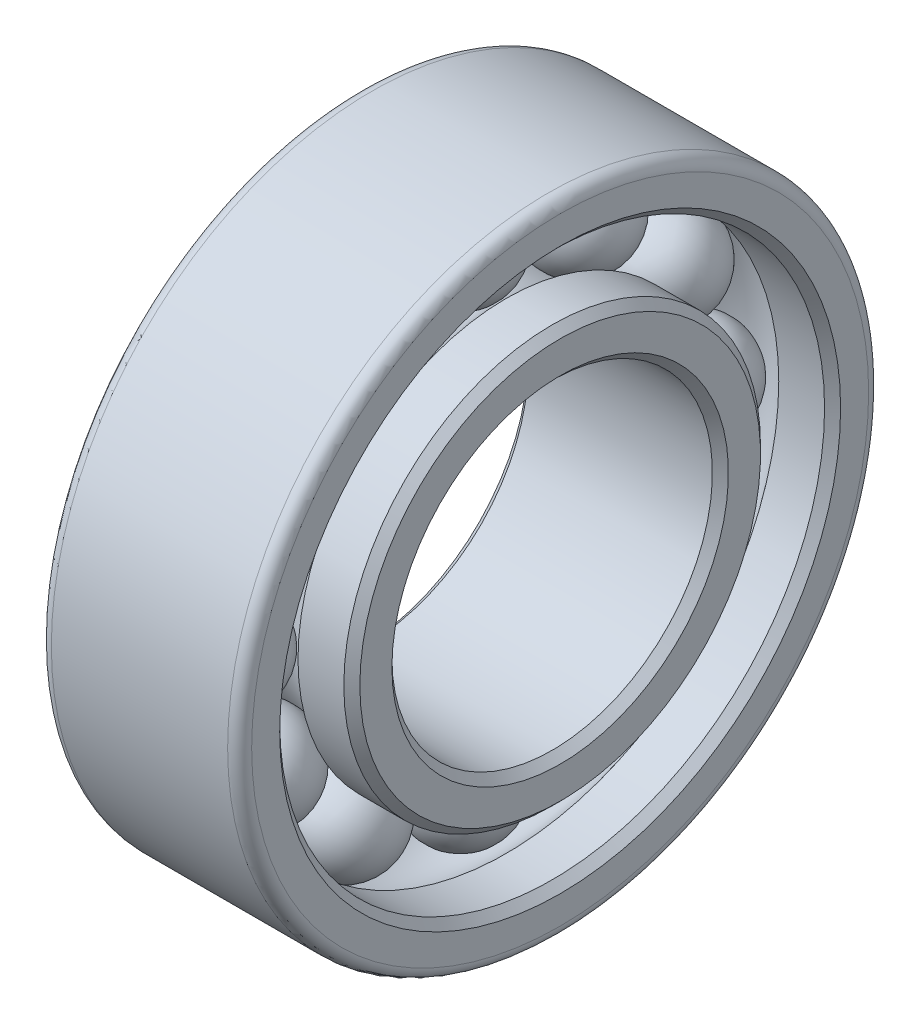
ISO-10303-21;
HEADER;
FILE_DESCRIPTION(('STEP AP214'),'2;1');
FILE_NAME('part.step','',(''),(''),'','','');
FILE_SCHEMA(('AUTOMOTIVE_DESIGN { 1 0 10303 214 1 1 1 1 }'));
ENDSEC;
DATA;
#1=APPLICATION_CONTEXT('core data for automotive mechanical design processes');
#2=APPLICATION_PROTOCOL_DEFINITION('international standard','automotive_design',2000,#1);
#3=PRODUCT_CONTEXT('',#1,'mechanical');
#4=PRODUCT('Part','Part','',(#3));
#5=PRODUCT_RELATED_PRODUCT_CATEGORY('part','',(#4));
#6=PRODUCT_DEFINITION_FORMATION('','',#4);
#7=PRODUCT_DEFINITION_CONTEXT('part definition',#1,'design');
#8=PRODUCT_DEFINITION('design','',#6,#7);
#9=PRODUCT_DEFINITION_SHAPE('','',#8);
#10=(LENGTH_UNIT() NAMED_UNIT(*) SI_UNIT(.MILLI.,.METRE.));
#11=(NAMED_UNIT(*) PLANE_ANGLE_UNIT() SI_UNIT($,.RADIAN.));
#12=(NAMED_UNIT(*) SI_UNIT($,.STERADIAN.) SOLID_ANGLE_UNIT());
#13=UNCERTAINTY_MEASURE_WITH_UNIT(LENGTH_MEASURE(1.E-05),#10,'distance_accuracy_value','');
#14=(GEOMETRIC_REPRESENTATION_CONTEXT(3) GLOBAL_UNCERTAINTY_ASSIGNED_CONTEXT((#13)) GLOBAL_UNIT_ASSIGNED_CONTEXT((#10,
#11,#12)) REPRESENTATION_CONTEXT('',''));
#15=CARTESIAN_POINT('',(0.,0.,0.));
#16=DIRECTION('',(0.,0.,1.));
#17=DIRECTION('',(1.,0.,0.));
#18=AXIS2_PLACEMENT_3D('',#15,#16,#17);
#19=CARTESIAN_POINT('',(2.51062289614978,1.06849757774923,2.9262984409004));
#20=DIRECTION('',(0.,0.866025403784445,0.499999999999989));
#21=DIRECTION('',(-1.,0.,0.));
#22=AXIS2_PLACEMENT_3D('',#19,#20,#21);
#23=SPHERICAL_SURFACE('',#22,1.25);
#24=CARTESIAN_POINT('',(2.51062289614978,2.15102933247978,3.55129844090038));
#25=VERTEX_POINT('',#24);
#26=VERTEX_LOOP('',#25);
#27=FACE_BOUND('',#26,.T.);
#28=ADVANCED_FACE('F41',(#27),#23,.T.);
#29=CLOSED_SHELL('',(#28));
#30=MANIFOLD_SOLID_BREP('B2',#29);
#31=CARTESIAN_POINT('',(2.51062289614978,-1.07370155909948,5.06849757774915));
#32=DIRECTION('',(0.,0.50000000000001,0.866025403784433));
#33=DIRECTION('',(-1.,0.,0.));
#34=AXIS2_PLACEMENT_3D('',#31,#32,#33);
#35=SPHERICAL_SURFACE('',#34,1.25);
#36=CARTESIAN_POINT('',(2.51062289614978,-0.448701559099468,6.1510293324797));
#37=VERTEX_POINT('',#36);
#38=VERTEX_LOOP('',#37);
#39=FACE_BOUND('',#38,.T.);
#40=ADVANCED_FACE('F61',(#39),#35,.T.);
#41=CLOSED_SHELL('',(#40));
#42=MANIFOLD_SOLID_BREP('B6',#41);
#43=CARTESIAN_POINT('',(2.51062289614978,-3.99999999999994,5.85259688180092));
#44=DIRECTION('',(0.,0.,1.));
#45=DIRECTION('',(-1.,0.,0.));
#46=AXIS2_PLACEMENT_3D('',#43,#44,#45);
#47=SPHERICAL_SURFACE('',#46,1.25);
#48=CARTESIAN_POINT('',(2.51062289614978,-3.99999999999993,7.10259688180092));
#49=VERTEX_POINT('',#48);
#50=VERTEX_LOOP('',#49);
#51=FACE_BOUND('',#50,.T.);
#52=ADVANCED_FACE('F81',(#51),#47,.T.);
#53=CLOSED_SHELL('',(#52));
#54=MANIFOLD_SOLID_BREP('B37',#53);
#55=CARTESIAN_POINT('',(2.51062289614978,-6.92629844090041,5.06849757774922));
#56=DIRECTION('',(0.,-0.499999999999992,0.866025403784443));
#57=DIRECTION('',(-1.,0.,0.));
#58=AXIS2_PLACEMENT_3D('',#55,#56,#57);
#59=SPHERICAL_SURFACE('',#58,1.25);
#60=CARTESIAN_POINT('',(2.51062289614978,-7.5512984409004,6.15102933247977));
#61=VERTEX_POINT('',#60);
#62=VERTEX_LOOP('',#61);
#63=FACE_BOUND('',#62,.T.);
#64=ADVANCED_FACE('F101',(#63),#59,.T.);
#65=CLOSED_SHELL('',(#64));
#66=MANIFOLD_SOLID_BREP('B57',#65);
#67=CARTESIAN_POINT('',(2.51062289614978,-9.06849757774916,2.9262984409005));
#68=DIRECTION('',(0.,-0.866025403784435,0.500000000000007));
#69=DIRECTION('',(-1.,0.,0.));
#70=AXIS2_PLACEMENT_3D('',#67,#68,#69);
#71=SPHERICAL_SURFACE('',#70,1.25);
#72=CARTESIAN_POINT('',(2.51062289614978,-10.1510293324797,3.55129844090051));
#73=VERTEX_POINT('',#72);
#74=VERTEX_LOOP('',#73);
#75=FACE_BOUND('',#74,.T.);
#76=ADVANCED_FACE('F121',(#75),#71,.T.);
#77=CLOSED_SHELL('',(#76));
#78=MANIFOLD_SOLID_BREP('B77',#77);
#79=CARTESIAN_POINT('',(2.51062289614978,-9.85259688180092,0.));
#80=DIRECTION('',(0.,-1.,0.));
#81=DIRECTION('',(-1.,0.,0.));
#82=AXIS2_PLACEMENT_3D('',#79,#80,#81);
#83=SPHERICAL_SURFACE('',#82,1.25);
#84=CARTESIAN_POINT('',(2.51062289614978,-11.1025968818009,0.));
#85=VERTEX_POINT('',#84);
#86=VERTEX_LOOP('',#85);
#87=FACE_BOUND('',#86,.T.);
#88=ADVANCED_FACE('F141',(#87),#83,.T.);
#89=CLOSED_SHELL('',(#88));
#90=MANIFOLD_SOLID_BREP('B97',#89);
#91=CARTESIAN_POINT('',(2.51062289614978,-9.06849757774921,-2.92629844090043));
#92=DIRECTION('',(0.,-0.866025403784442,-0.499999999999995));
#93=DIRECTION('',(-1.,0.,0.));
#94=AXIS2_PLACEMENT_3D('',#91,#92,#93);
#95=SPHERICAL_SURFACE('',#94,1.25);
#96=CARTESIAN_POINT('',(2.51062289614978,-10.1510293324798,-3.55129844090042));
#97=VERTEX_POINT('',#96);
#98=VERTEX_LOOP('',#97);
#99=FACE_BOUND('',#98,.T.);
#100=ADVANCED_FACE('F161',(#99),#95,.T.);
#101=CLOSED_SHELL('',(#100));
#102=MANIFOLD_SOLID_BREP('B117',#101);
#103=CARTESIAN_POINT('',(2.51062289614978,-6.92629844090048,-5.06849757774918));
#104=DIRECTION('',(0.,-0.500000000000004,-0.866025403784436));
#105=DIRECTION('',(-1.,0.,0.));
#106=AXIS2_PLACEMENT_3D('',#103,#104,#105);
#107=SPHERICAL_SURFACE('',#106,1.25);
#108=CARTESIAN_POINT('',(2.51062289614978,-7.55129844090049,-6.15102933247972));
#109=VERTEX_POINT('',#108);
#110=VERTEX_LOOP('',#109);
#111=FACE_BOUND('',#110,.T.);
#112=ADVANCED_FACE('F181',(#111),#107,.T.);
#113=CLOSED_SHELL('',(#112));
#114=MANIFOLD_SOLID_BREP('B137',#113);
#115=CARTESIAN_POINT('',(2.51062289614978,-4.00000000000002,-5.85259688180092));
#116=DIRECTION('',(0.,0.,-1.));
#117=DIRECTION('',(-1.,0.,0.));
#118=AXIS2_PLACEMENT_3D('',#115,#116,#117);
#119=SPHERICAL_SURFACE('',#118,1.25);
#120=CARTESIAN_POINT('',(2.51062289614978,-4.00000000000002,-7.10259688180092));
#121=VERTEX_POINT('',#120);
#122=VERTEX_LOOP('',#121);
#123=FACE_BOUND('',#122,.T.);
#124=ADVANCED_FACE('F201',(#123),#119,.T.);
#125=CLOSED_SHELL('',(#124));
#126=MANIFOLD_SOLID_BREP('B157',#125);
#127=CARTESIAN_POINT('',(2.51062289614978,-1.07370155909955,-5.0684975777492));
#128=DIRECTION('',(0.,0.499999999999998,-0.86602540378444));
#129=DIRECTION('',(-1.,0.,0.));
#130=AXIS2_PLACEMENT_3D('',#127,#128,#129);
#131=SPHERICAL_SURFACE('',#130,1.25);
#132=CARTESIAN_POINT('',(2.51062289614978,-0.448701559099554,-6.15102933247975));
#133=VERTEX_POINT('',#132);
#134=VERTEX_LOOP('',#133);
#135=FACE_BOUND('',#134,.T.);
#136=ADVANCED_FACE('F221',(#135),#131,.T.);
#137=CLOSED_SHELL('',(#136));
#138=MANIFOLD_SOLID_BREP('B177',#137);
#139=CARTESIAN_POINT('',(2.51062289614978,1.06849757774919,-2.92629844090047));
#140=DIRECTION('',(0.,0.866025403784438,-0.500000000000001));
#141=DIRECTION('',(-1.,0.,0.));
#142=AXIS2_PLACEMENT_3D('',#139,#140,#141);
#143=SPHERICAL_SURFACE('',#142,1.25);
#144=CARTESIAN_POINT('',(2.51062289614978,2.15102933247973,-3.55129844090047));
#145=VERTEX_POINT('',#144);
#146=VERTEX_LOOP('',#145);
#147=FACE_BOUND('',#146,.T.);
#148=ADVANCED_FACE('F241',(#147),#143,.T.);
#149=CLOSED_SHELL('',(#148));
#150=MANIFOLD_SOLID_BREP('B197',#149);
#151=CARTESIAN_POINT('',(2.51062289614978,1.85259688180092,0.));
#152=DIRECTION('',(0.,1.,0.));
#153=DIRECTION('',(-1.,0.,0.));
#154=AXIS2_PLACEMENT_3D('',#151,#152,#153);
#155=SPHERICAL_SURFACE('',#154,1.25);
#156=CARTESIAN_POINT('',(2.51062289614978,3.10259688180092,0.));
#157=VERTEX_POINT('',#156);
#158=VERTEX_LOOP('',#157);
#159=FACE_BOUND('',#158,.T.);
#160=ADVANCED_FACE('F263',(#159),#155,.T.);
#161=CLOSED_SHELL('',(#160));
#162=MANIFOLD_SOLID_BREP('B217',#161);
#163=CARTESIAN_POINT('',(0.,2.8,0.));
#164=DIRECTION('',(1.,0.,0.));
#165=DIRECTION('',(0.,0.,-1.));
#166=AXIS2_PLACEMENT_3D('',#163,#164,#165);
#167=PLANE('',#166);
#168=CARTESIAN_POINT('',(0.,-4.,0.));
#169=DIRECTION('',(1.,0.,0.));
#170=DIRECTION('',(0.,0.,-1.));
#171=AXIS2_PLACEMENT_3D('',#168,#169,#170);
#172=CIRCLE('',#171,7.);
#173=CARTESIAN_POINT('',(0.,-4.,-7.));
#174=VERTEX_POINT('',#173);
#175=EDGE_CURVE('E262',#174,#174,#172,.T.);
#176=ORIENTED_EDGE('',*,*,#175,.T.);
#177=EDGE_LOOP('',(#176));
#178=FACE_BOUND('',#177,.T.);
#179=CARTESIAN_POINT('',(0.,-4.,0.));
#180=DIRECTION('',(1.,0.,0.));
#181=DIRECTION('',(0.,0.,-1.));
#182=AXIS2_PLACEMENT_3D('',#179,#180,#181);
#183=CIRCLE('',#182,7.7);
#184=CARTESIAN_POINT('',(0.,-4.,-7.7));
#185=VERTEX_POINT('',#184);
#186=EDGE_CURVE('E302',#185,#185,#183,.F.);
#187=ORIENTED_EDGE('',*,*,#186,.T.);
#188=EDGE_LOOP('',(#187));
#189=FACE_BOUND('',#188,.T.);
#190=ADVANCED_FACE('F282',(#178,#189),#167,.F.);
#191=CARTESIAN_POINT('',(-1.0669014084507,-4.,0.));
#192=DIRECTION('',(-1.,0.,0.));
#193=DIRECTION('',(0.,0.,1.));
#194=AXIS2_PLACEMENT_3D('',#191,#192,#193);
#195=CYLINDRICAL_SURFACE('',#194,6.8);
#196=CARTESIAN_POINT('',(0.199999999999998,-4.,0.));
#197=DIRECTION('',(1.,0.,0.));
#198=DIRECTION('',(0.,0.,-1.));
#199=AXIS2_PLACEMENT_3D('',#196,#197,#198);
#200=CIRCLE('',#199,6.8);
#201=CARTESIAN_POINT('',(0.199999999999998,-4.,-6.8));
#202=VERTEX_POINT('',#201);
#203=EDGE_CURVE('E289',#202,#202,#200,.F.);
#204=ORIENTED_EDGE('',*,*,#203,.T.);
#205=EDGE_LOOP('',(#204));
#206=FACE_BOUND('',#205,.T.);
#207=CARTESIAN_POINT('',(1.36487620741247,-4.,0.));
#208=DIRECTION('',(-1.,0.,0.));
#209=DIRECTION('',(0.,0.,1.));
#210=AXIS2_PLACEMENT_3D('',#207,#208,#209);
#211=CIRCLE('',#210,6.8);
#212=CARTESIAN_POINT('',(1.36487620741247,-4.,6.8));
#213=VERTEX_POINT('',#212);
#214=EDGE_CURVE('E314',#213,#213,#211,.T.);
#215=ORIENTED_EDGE('',*,*,#214,.F.);
#216=EDGE_LOOP('',(#215));
#217=FACE_BOUND('',#216,.T.);
#218=ADVANCED_FACE('F326',(#206,#217),#195,.F.);
#219=CARTESIAN_POINT('',(2.51062289614978,-4.,0.));
#220=DIRECTION('',(-1.,0.,0.));
#221=DIRECTION('',(0.,0.,1.));
#222=AXIS2_PLACEMENT_3D('',#219,#220,#221);
#223=TOROIDAL_SURFACE('',#222,6.,1.39740311819908);
#224=CARTESIAN_POINT('',(3.65636958488709,-4.,0.));
#225=DIRECTION('',(-1.,0.,0.));
#226=DIRECTION('',(0.,0.,1.));
#227=AXIS2_PLACEMENT_3D('',#224,#225,#226);
#228=CIRCLE('',#227,6.8);
#229=CARTESIAN_POINT('',(3.65636958488709,-4.,6.8));
#230=VERTEX_POINT('',#229);
#231=EDGE_CURVE('E317',#230,#230,#228,.T.);
#232=ORIENTED_EDGE('',*,*,#231,.F.);
#233=EDGE_LOOP('',(#232));
#234=FACE_BOUND('',#233,.T.);
#235=ORIENTED_EDGE('',*,*,#214,.T.);
#236=EDGE_LOOP('',(#235));
#237=FACE_BOUND('',#236,.T.);
#238=ADVANCED_FACE('F323',(#234,#237),#223,.F.);
#239=CARTESIAN_POINT('',(-1.0669014084507,-4.,0.));
#240=DIRECTION('',(-1.,0.,0.));
#241=DIRECTION('',(0.,0.,1.));
#242=AXIS2_PLACEMENT_3D('',#239,#240,#241);
#243=CYLINDRICAL_SURFACE('',#242,6.8);
#244=CARTESIAN_POINT('',(4.8,-4.,0.));
#245=DIRECTION('',(-1.,0.,0.));
#246=DIRECTION('',(0.,0.,1.));
#247=AXIS2_PLACEMENT_3D('',#244,#245,#246);
#248=CIRCLE('',#247,6.8);
#249=CARTESIAN_POINT('',(4.8,-4.,6.8));
#250=VERTEX_POINT('',#249);
#251=EDGE_CURVE('E293',#250,#250,#248,.F.);
#252=ORIENTED_EDGE('',*,*,#251,.T.);
#253=EDGE_LOOP('',(#252));
#254=FACE_BOUND('',#253,.T.);
#255=ORIENTED_EDGE('',*,*,#231,.T.);
#256=EDGE_LOOP('',(#255));
#257=FACE_BOUND('',#256,.T.);
#258=ADVANCED_FACE('F321',(#254,#257),#243,.F.);
#259=CARTESIAN_POINT('',(5.,2.8,0.));
#260=DIRECTION('',(-1.,0.,0.));
#261=DIRECTION('',(0.,0.,1.));
#262=AXIS2_PLACEMENT_3D('',#259,#260,#261);
#263=PLANE('',#262);
#264=CARTESIAN_POINT('',(5.,-4.,0.));
#265=DIRECTION('',(-1.,0.,0.));
#266=DIRECTION('',(0.,0.,1.));
#267=AXIS2_PLACEMENT_3D('',#264,#265,#266);
#268=CIRCLE('',#267,7.);
#269=CARTESIAN_POINT('',(5.,-4.,7.));
#270=VERTEX_POINT('',#269);
#271=EDGE_CURVE('E297',#270,#270,#268,.T.);
#272=ORIENTED_EDGE('',*,*,#271,.T.);
#273=EDGE_LOOP('',(#272));
#274=FACE_BOUND('',#273,.T.);
#275=CARTESIAN_POINT('',(5.,-4.,0.));
#276=DIRECTION('',(-1.,0.,0.));
#277=DIRECTION('',(0.,0.,1.));
#278=AXIS2_PLACEMENT_3D('',#275,#276,#277);
#279=CIRCLE('',#278,7.7);
#280=CARTESIAN_POINT('',(5.,-4.,7.7));
#281=VERTEX_POINT('',#280);
#282=EDGE_CURVE('E305',#281,#281,#279,.F.);
#283=ORIENTED_EDGE('',*,*,#282,.T.);
#284=EDGE_LOOP('',(#283));
#285=FACE_BOUND('',#284,.T.);
#286=ADVANCED_FACE('F357',(#274,#285),#263,.F.);
#287=CARTESIAN_POINT('',(-1.0669014084507,-4.,0.));
#288=DIRECTION('',(-1.,0.,0.));
#289=DIRECTION('',(0.,0.,1.));
#290=AXIS2_PLACEMENT_3D('',#287,#288,#289);
#291=CYLINDRICAL_SURFACE('',#290,8.);
#292=CARTESIAN_POINT('',(4.7,-4.,0.));
#293=DIRECTION('',(-1.,0.,0.));
#294=DIRECTION('',(0.,0.,1.));
#295=AXIS2_PLACEMENT_3D('',#292,#293,#294);
#296=CIRCLE('',#295,8.);
#297=CARTESIAN_POINT('',(4.7,-4.,8.));
#298=VERTEX_POINT('',#297);
#299=EDGE_CURVE('E308',#298,#298,#296,.T.);
#300=ORIENTED_EDGE('',*,*,#299,.T.);
#301=EDGE_LOOP('',(#300));
#302=FACE_BOUND('',#301,.T.);
#303=CARTESIAN_POINT('',(0.3,-4.,0.));
#304=DIRECTION('',(1.,0.,0.));
#305=DIRECTION('',(0.,0.,-1.));
#306=AXIS2_PLACEMENT_3D('',#303,#304,#305);
#307=CIRCLE('',#306,8.);
#308=CARTESIAN_POINT('',(0.3,-4.,-8.));
#309=VERTEX_POINT('',#308);
#310=EDGE_CURVE('E311',#309,#309,#307,.T.);
#311=ORIENTED_EDGE('',*,*,#310,.T.);
#312=EDGE_LOOP('',(#311));
#313=FACE_BOUND('',#312,.T.);
#314=ADVANCED_FACE('F342',(#302,#313),#291,.T.);
#315=CARTESIAN_POINT('',(4.7,-4.,0.));
#316=DIRECTION('',(-1.,0.,0.));
#317=DIRECTION('',(0.,0.,1.));
#318=AXIS2_PLACEMENT_3D('',#315,#316,#317);
#319=TOROIDAL_SURFACE('',#318,7.7,0.3);
#320=ORIENTED_EDGE('',*,*,#282,.F.);
#321=EDGE_LOOP('',(#320));
#322=FACE_BOUND('',#321,.T.);
#323=ORIENTED_EDGE('',*,*,#299,.F.);
#324=EDGE_LOOP('',(#323));
#325=FACE_BOUND('',#324,.T.);
#326=ADVANCED_FACE('F338',(#322,#325),#319,.T.);
#327=CARTESIAN_POINT('',(0.3,-4.,0.));
#328=DIRECTION('',(1.,0.,0.));
#329=DIRECTION('',(0.,0.,-1.));
#330=AXIS2_PLACEMENT_3D('',#327,#328,#329);
#331=TOROIDAL_SURFACE('',#330,7.7,0.3);
#332=ORIENTED_EDGE('',*,*,#310,.F.);
#333=EDGE_LOOP('',(#332));
#334=FACE_BOUND('',#333,.T.);
#335=ORIENTED_EDGE('',*,*,#186,.F.);
#336=EDGE_LOOP('',(#335));
#337=FACE_BOUND('',#336,.T.);
#338=ADVANCED_FACE('F341',(#334,#337),#331,.T.);
#339=CARTESIAN_POINT('',(5.,-4.,0.));
#340=DIRECTION('',(1.,0.,0.));
#341=DIRECTION('',(0.,0.,-1.));
#342=AXIS2_PLACEMENT_3D('',#339,#340,#341);
#343=CONICAL_SURFACE('',#342,7.,0.785398163397442);
#344=ORIENTED_EDGE('',*,*,#251,.F.);
#345=EDGE_LOOP('',(#344));
#346=FACE_BOUND('',#345,.T.);
#347=ORIENTED_EDGE('',*,*,#271,.F.);
#348=EDGE_LOOP('',(#347));
#349=FACE_BOUND('',#348,.T.);
#350=ADVANCED_FACE('F345',(#346,#349),#343,.F.);
#351=CARTESIAN_POINT('',(0.199999999999998,-4.,0.));
#352=DIRECTION('',(-1.,0.,0.));
#353=DIRECTION('',(0.,0.,1.));
#354=AXIS2_PLACEMENT_3D('',#351,#352,#353);
#355=CONICAL_SURFACE('',#354,6.8,0.78539816339745);
#356=ORIENTED_EDGE('',*,*,#175,.F.);
#357=EDGE_LOOP('',(#356));
#358=FACE_BOUND('',#357,.T.);
#359=ORIENTED_EDGE('',*,*,#203,.F.);
#360=EDGE_LOOP('',(#359));
#361=FACE_BOUND('',#360,.T.);
#362=ADVANCED_FACE('F284',(#358,#361),#355,.F.);
#363=CLOSED_SHELL('',(#190,#218,#238,#258,#286,#314,#326,#338,#350,#362));
#364=MANIFOLD_SOLID_BREP('B237',#363);
#365=CARTESIAN_POINT('',(0.,0.,0.));
#366=DIRECTION('',(1.,0.,0.));
#367=DIRECTION('',(0.,0.,-1.));
#368=AXIS2_PLACEMENT_3D('',#365,#366,#367);
#369=PLANE('',#368);
#370=CARTESIAN_POINT('',(0.,-4.,0.));
#371=DIRECTION('',(1.,0.,0.));
#372=DIRECTION('',(0.,0.,-1.));
#373=AXIS2_PLACEMENT_3D('',#370,#371,#372);
#374=CIRCLE('',#373,4.2);
#375=CARTESIAN_POINT('',(0.,-4.,-4.2));
#376=VERTEX_POINT('',#375);
#377=EDGE_CURVE('E457',#376,#376,#374,.T.);
#378=ORIENTED_EDGE('',*,*,#377,.T.);
#379=EDGE_LOOP('',(#378));
#380=FACE_BOUND('',#379,.T.);
#381=CARTESIAN_POINT('',(0.,-4.,0.));
#382=DIRECTION('',(1.,0.,0.));
#383=DIRECTION('',(0.,0.,-1.));
#384=AXIS2_PLACEMENT_3D('',#381,#382,#383);
#385=CIRCLE('',#384,5.);
#386=CARTESIAN_POINT('',(0.,-4.,-5.));
#387=VERTEX_POINT('',#386);
#388=EDGE_CURVE('E460',#387,#387,#385,.F.);
#389=ORIENTED_EDGE('',*,*,#388,.T.);
#390=EDGE_LOOP('',(#389));
#391=FACE_BOUND('',#390,.T.);
#392=ADVANCED_FACE('F437',(#380,#391),#369,.F.);
#393=CARTESIAN_POINT('',(-1.0669014084507,-4.,0.));
#394=DIRECTION('',(-1.,0.,0.));
#395=DIRECTION('',(0.,0.,1.));
#396=AXIS2_PLACEMENT_3D('',#393,#394,#395);
#397=CYLINDRICAL_SURFACE('',#396,4.);
#398=CARTESIAN_POINT('',(0.200000000000001,-4.,0.));
#399=DIRECTION('',(1.,0.,0.));
#400=DIRECTION('',(0.,0.,-1.));
#401=AXIS2_PLACEMENT_3D('',#398,#399,#400);
#402=CIRCLE('',#401,4.);
#403=CARTESIAN_POINT('',(0.200000000000001,-4.,-4.));
#404=VERTEX_POINT('',#403);
#405=EDGE_CURVE('E463',#404,#404,#402,.F.);
#406=ORIENTED_EDGE('',*,*,#405,.T.);
#407=EDGE_LOOP('',(#406));
#408=FACE_BOUND('',#407,.T.);
#409=CARTESIAN_POINT('',(4.8,-4.,0.));
#410=DIRECTION('',(-1.,0.,0.));
#411=DIRECTION('',(0.,0.,1.));
#412=AXIS2_PLACEMENT_3D('',#409,#410,#411);
#413=CIRCLE('',#412,4.);
#414=CARTESIAN_POINT('',(4.8,-4.,4.));
#415=VERTEX_POINT('',#414);
#416=EDGE_CURVE('E466',#415,#415,#413,.F.);
#417=ORIENTED_EDGE('',*,*,#416,.T.);
#418=EDGE_LOOP('',(#417));
#419=FACE_BOUND('',#418,.T.);
#420=ADVANCED_FACE('F491',(#408,#419),#397,.F.);
#421=CARTESIAN_POINT('',(5.,0.,0.));
#422=DIRECTION('',(-1.,0.,0.));
#423=DIRECTION('',(0.,0.,1.));
#424=AXIS2_PLACEMENT_3D('',#421,#422,#423);
#425=PLANE('',#424);
#426=CARTESIAN_POINT('',(5.,-4.,0.));
#427=DIRECTION('',(-1.,0.,0.));
#428=DIRECTION('',(0.,0.,1.));
#429=AXIS2_PLACEMENT_3D('',#426,#427,#428);
#430=CIRCLE('',#429,4.2);
#431=CARTESIAN_POINT('',(5.,-4.,4.2));
#432=VERTEX_POINT('',#431);
#433=EDGE_CURVE('E448',#432,#432,#430,.T.);
#434=ORIENTED_EDGE('',*,*,#433,.T.);
#435=EDGE_LOOP('',(#434));
#436=FACE_BOUND('',#435,.T.);
#437=CARTESIAN_POINT('',(5.,-4.,0.));
#438=DIRECTION('',(-1.,0.,0.));
#439=DIRECTION('',(0.,0.,1.));
#440=AXIS2_PLACEMENT_3D('',#437,#438,#439);
#441=CIRCLE('',#440,5.);
#442=CARTESIAN_POINT('',(5.,-4.,5.));
#443=VERTEX_POINT('',#442);
#444=EDGE_CURVE('E452',#443,#443,#441,.F.);
#445=ORIENTED_EDGE('',*,*,#444,.T.);
#446=EDGE_LOOP('',(#445));
#447=FACE_BOUND('',#446,.T.);
#448=ADVANCED_FACE('F486',(#436,#447),#425,.F.);
#449=CARTESIAN_POINT('',(-1.0669014084507,-4.,0.));
#450=DIRECTION('',(-1.,0.,0.));
#451=DIRECTION('',(0.,0.,1.));
#452=AXIS2_PLACEMENT_3D('',#449,#450,#451);
#453=CYLINDRICAL_SURFACE('',#452,5.2);
#454=CARTESIAN_POINT('',(4.8,-4.,0.));
#455=DIRECTION('',(-1.,0.,0.));
#456=DIRECTION('',(0.,0.,1.));
#457=AXIS2_PLACEMENT_3D('',#454,#455,#456);
#458=CIRCLE('',#457,5.2);
#459=CARTESIAN_POINT('',(4.8,-4.,5.2));
#460=VERTEX_POINT('',#459);
#461=EDGE_CURVE('E444',#460,#460,#458,.T.);
#462=ORIENTED_EDGE('',*,*,#461,.T.);
#463=EDGE_LOOP('',(#462));
#464=FACE_BOUND('',#463,.T.);
#465=CARTESIAN_POINT('',(3.65636958488709,-4.,0.));
#466=DIRECTION('',(-1.,0.,0.));
#467=DIRECTION('',(0.,0.,1.));
#468=AXIS2_PLACEMENT_3D('',#465,#466,#467);
#469=CIRCLE('',#468,5.2);
#470=CARTESIAN_POINT('',(3.65636958488709,-4.,5.2));
#471=VERTEX_POINT('',#470);
#472=EDGE_CURVE('E469',#471,#471,#469,.T.);
#473=ORIENTED_EDGE('',*,*,#472,.F.);
#474=EDGE_LOOP('',(#473));
#475=FACE_BOUND('',#474,.T.);
#476=ADVANCED_FACE('F481',(#464,#475),#453,.T.);
#477=CARTESIAN_POINT('',(2.51062289614978,-4.,0.));
#478=DIRECTION('',(-1.,0.,0.));
#479=DIRECTION('',(0.,0.,1.));
#480=AXIS2_PLACEMENT_3D('',#477,#478,#479);
#481=TOROIDAL_SURFACE('',#480,6.,1.39740311819908);
#482=CARTESIAN_POINT('',(1.36487620741247,-4.,0.));
#483=DIRECTION('',(-1.,0.,0.));
#484=DIRECTION('',(0.,0.,1.));
#485=AXIS2_PLACEMENT_3D('',#482,#483,#484);
#486=CIRCLE('',#485,5.2);
#487=CARTESIAN_POINT('',(1.36487620741247,-4.,5.2));
#488=VERTEX_POINT('',#487);
#489=EDGE_CURVE('E472',#488,#488,#486,.T.);
#490=ORIENTED_EDGE('',*,*,#489,.F.);
#491=EDGE_LOOP('',(#490));
#492=FACE_BOUND('',#491,.T.);
#493=ORIENTED_EDGE('',*,*,#472,.T.);
#494=EDGE_LOOP('',(#493));
#495=FACE_BOUND('',#494,.T.);
#496=ADVANCED_FACE('F478',(#492,#495),#481,.F.);
#497=CARTESIAN_POINT('',(-1.0669014084507,-4.,0.));
#498=DIRECTION('',(-1.,0.,0.));
#499=DIRECTION('',(0.,0.,1.));
#500=AXIS2_PLACEMENT_3D('',#497,#498,#499);
#501=CYLINDRICAL_SURFACE('',#500,5.2);
#502=CARTESIAN_POINT('',(0.200000000000006,-4.,0.));
#503=DIRECTION('',(1.,0.,0.));
#504=DIRECTION('',(0.,0.,-1.));
#505=AXIS2_PLACEMENT_3D('',#502,#503,#504);
#506=CIRCLE('',#505,5.2);
#507=CARTESIAN_POINT('',(0.200000000000006,-4.,-5.2));
#508=VERTEX_POINT('',#507);
#509=EDGE_CURVE('E281',#508,#508,#506,.T.);
#510=ORIENTED_EDGE('',*,*,#509,.T.);
#511=EDGE_LOOP('',(#510));
#512=FACE_BOUND('',#511,.T.);
#513=ORIENTED_EDGE('',*,*,#489,.T.);
#514=EDGE_LOOP('',(#513));
#515=FACE_BOUND('',#514,.T.);
#516=ADVANCED_FACE('F476',(#512,#515),#501,.T.);
#517=CARTESIAN_POINT('',(0.200000000000001,-4.,0.));
#518=DIRECTION('',(-1.,0.,0.));
#519=DIRECTION('',(0.,0.,1.));
#520=AXIS2_PLACEMENT_3D('',#517,#518,#519);
#521=CONICAL_SURFACE('',#520,4.,0.785398163397448);
#522=ORIENTED_EDGE('',*,*,#377,.F.);
#523=EDGE_LOOP('',(#522));
#524=FACE_BOUND('',#523,.T.);
#525=ORIENTED_EDGE('',*,*,#405,.F.);
#526=EDGE_LOOP('',(#525));
#527=FACE_BOUND('',#526,.T.);
#528=ADVANCED_FACE('F504',(#524,#527),#521,.F.);
#529=CARTESIAN_POINT('',(5.,-4.,0.));
#530=DIRECTION('',(1.,0.,0.));
#531=DIRECTION('',(0.,0.,-1.));
#532=AXIS2_PLACEMENT_3D('',#529,#530,#531);
#533=CONICAL_SURFACE('',#532,4.2,0.785398163397442);
#534=ORIENTED_EDGE('',*,*,#416,.F.);
#535=EDGE_LOOP('',(#534));
#536=FACE_BOUND('',#535,.T.);
#537=ORIENTED_EDGE('',*,*,#433,.F.);
#538=EDGE_LOOP('',(#537));
#539=FACE_BOUND('',#538,.T.);
#540=ADVANCED_FACE('F507',(#536,#539),#533,.F.);
#541=CARTESIAN_POINT('',(4.8,-4.,0.));
#542=DIRECTION('',(-1.,0.,0.));
#543=DIRECTION('',(0.,0.,1.));
#544=AXIS2_PLACEMENT_3D('',#541,#542,#543);
#545=CONICAL_SURFACE('',#544,5.2,0.78539816339745);
#546=ORIENTED_EDGE('',*,*,#444,.F.);
#547=EDGE_LOOP('',(#546));
#548=FACE_BOUND('',#547,.T.);
#549=ORIENTED_EDGE('',*,*,#461,.F.);
#550=EDGE_LOOP('',(#549));
#551=FACE_BOUND('',#550,.T.);
#552=ADVANCED_FACE('F510',(#548,#551),#545,.T.);
#553=CARTESIAN_POINT('',(0.,-4.,0.));
#554=DIRECTION('',(1.,0.,0.));
#555=DIRECTION('',(0.,0.,-1.));
#556=AXIS2_PLACEMENT_3D('',#553,#554,#555);
#557=CONICAL_SURFACE('',#556,5.,0.785398163397444);
#558=ORIENTED_EDGE('',*,*,#509,.F.);
#559=EDGE_LOOP('',(#558));
#560=FACE_BOUND('',#559,.T.);
#561=ORIENTED_EDGE('',*,*,#388,.F.);
#562=EDGE_LOOP('',(#561));
#563=FACE_BOUND('',#562,.T.);
#564=ADVANCED_FACE('F439',(#560,#563),#557,.T.);
#565=CLOSED_SHELL('',(#392,#420,#448,#476,#496,#516,#528,#540,#552,#564));
#566=MANIFOLD_SOLID_BREP('B257',#565);
#567=ADVANCED_BREP_SHAPE_REPRESENTATION('',(#18,#30,#42,#54,#66,#78,#90,#102,#114,#126,#138,
#150,#162,#364,#566),#14);
#568=SHAPE_DEFINITION_REPRESENTATION(#9,#567);
ENDSEC;
END-ISO-10303-21;
